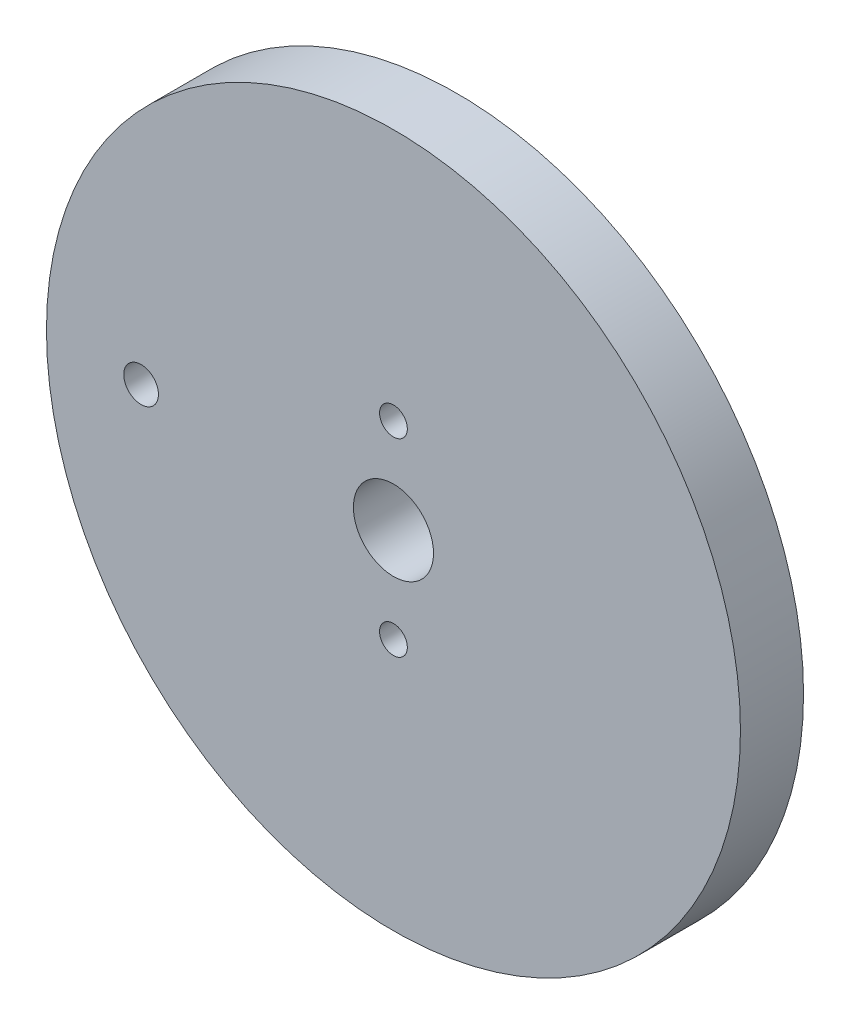
ISO-10303-21;
HEADER;
FILE_DESCRIPTION(('STEP AP214'),'2;1');
FILE_NAME('part.step','',(''),(''),'','','');
FILE_SCHEMA(('AUTOMOTIVE_DESIGN { 1 0 10303 214 1 1 1 1 }'));
ENDSEC;
DATA;
#1=APPLICATION_CONTEXT('core data for automotive mechanical design processes');
#2=APPLICATION_PROTOCOL_DEFINITION('international standard','automotive_design',2000,#1);
#3=PRODUCT_CONTEXT('',#1,'mechanical');
#4=PRODUCT('Part','Part','',(#3));
#5=PRODUCT_RELATED_PRODUCT_CATEGORY('part','',(#4));
#6=PRODUCT_DEFINITION_FORMATION('','',#4);
#7=PRODUCT_DEFINITION_CONTEXT('part definition',#1,'design');
#8=PRODUCT_DEFINITION('design','',#6,#7);
#9=PRODUCT_DEFINITION_SHAPE('','',#8);
#10=(LENGTH_UNIT() NAMED_UNIT(*) SI_UNIT(.MILLI.,.METRE.));
#11=(NAMED_UNIT(*) PLANE_ANGLE_UNIT() SI_UNIT($,.RADIAN.));
#12=(NAMED_UNIT(*) SI_UNIT($,.STERADIAN.) SOLID_ANGLE_UNIT());
#13=UNCERTAINTY_MEASURE_WITH_UNIT(LENGTH_MEASURE(1.E-05),#10,'distance_accuracy_value','');
#14=(GEOMETRIC_REPRESENTATION_CONTEXT(3) GLOBAL_UNCERTAINTY_ASSIGNED_CONTEXT((#13)) GLOBAL_UNIT_ASSIGNED_CONTEXT((#10,
#11,#12)) REPRESENTATION_CONTEXT('',''));
#15=CARTESIAN_POINT('',(0.,0.,0.));
#16=DIRECTION('',(0.,0.,1.));
#17=DIRECTION('',(1.,0.,0.));
#18=AXIS2_PLACEMENT_3D('',#15,#16,#17);
#19=CARTESIAN_POINT('',(0.,0.,10.));
#20=DIRECTION('',(0.,0.,-1.));
#21=DIRECTION('',(-1.,0.,0.));
#22=AXIS2_PLACEMENT_3D('',#19,#20,#21);
#23=CYLINDRICAL_SURFACE('',#22,55.);
#24=CARTESIAN_POINT('',(0.,0.,10.));
#25=DIRECTION('',(0.,0.,1.));
#26=DIRECTION('',(1.,0.,0.));
#27=AXIS2_PLACEMENT_3D('',#24,#25,#26);
#28=CIRCLE('',#27,55.);
#29=CARTESIAN_POINT('',(55.,0.,10.));
#30=VERTEX_POINT('',#29);
#31=EDGE_CURVE('E10',#30,#30,#28,.T.);
#32=ORIENTED_EDGE('',*,*,#31,.F.);
#33=EDGE_LOOP('',(#32));
#34=FACE_BOUND('',#33,.T.);
#35=CARTESIAN_POINT('',(0.,0.,0.));
#36=DIRECTION('',(0.,0.,1.));
#37=DIRECTION('',(1.,0.,0.));
#38=AXIS2_PLACEMENT_3D('',#35,#36,#37);
#39=CIRCLE('',#38,55.);
#40=CARTESIAN_POINT('',(55.,0.,0.));
#41=VERTEX_POINT('',#40);
#42=EDGE_CURVE('E46',#41,#41,#39,.T.);
#43=ORIENTED_EDGE('',*,*,#42,.T.);
#44=EDGE_LOOP('',(#43));
#45=FACE_BOUND('',#44,.T.);
#46=ADVANCED_FACE('F43',(#34,#45),#23,.T.);
#47=CARTESIAN_POINT('',(0.,0.,10.));
#48=DIRECTION('',(0.,0.,1.));
#49=DIRECTION('',(1.,0.,0.));
#50=AXIS2_PLACEMENT_3D('',#47,#48,#49);
#51=PLANE('',#50);
#52=CARTESIAN_POINT('',(-40.,0.,10.));
#53=DIRECTION('',(0.,0.,1.));
#54=DIRECTION('',(1.,0.,0.));
#55=AXIS2_PLACEMENT_3D('',#52,#53,#54);
#56=CIRCLE('',#55,2.74999999999999);
#57=CARTESIAN_POINT('',(-37.25,0.,10.));
#58=VERTEX_POINT('',#57);
#59=EDGE_CURVE('E81',#58,#58,#56,.T.);
#60=ORIENTED_EDGE('',*,*,#59,.F.);
#61=EDGE_LOOP('',(#60));
#62=FACE_BOUND('',#61,.T.);
#63=CARTESIAN_POINT('',(0.,15.,10.));
#64=DIRECTION('',(0.,0.,1.));
#65=DIRECTION('',(1.,0.,0.));
#66=AXIS2_PLACEMENT_3D('',#63,#64,#65);
#67=CIRCLE('',#66,2.2);
#68=CARTESIAN_POINT('',(2.2,15.,10.));
#69=VERTEX_POINT('',#68);
#70=EDGE_CURVE('E69',#69,#69,#67,.T.);
#71=ORIENTED_EDGE('',*,*,#70,.F.);
#72=EDGE_LOOP('',(#71));
#73=FACE_BOUND('',#72,.T.);
#74=CARTESIAN_POINT('',(3.23790517374325E-13,-15.,10.));
#75=DIRECTION('',(0.,0.,1.));
#76=DIRECTION('',(1.,0.,0.));
#77=AXIS2_PLACEMENT_3D('',#74,#75,#76);
#78=CIRCLE('',#77,2.2);
#79=CARTESIAN_POINT('',(2.20000000000032,-15.,10.));
#80=VERTEX_POINT('',#79);
#81=EDGE_CURVE('E70',#80,#80,#78,.T.);
#82=ORIENTED_EDGE('',*,*,#81,.F.);
#83=EDGE_LOOP('',(#82));
#84=FACE_BOUND('',#83,.T.);
#85=CARTESIAN_POINT('',(0.,0.,10.));
#86=DIRECTION('',(0.,0.,1.));
#87=DIRECTION('',(1.,0.,0.));
#88=AXIS2_PLACEMENT_3D('',#85,#86,#87);
#89=CIRCLE('',#88,6.35);
#90=CARTESIAN_POINT('',(6.35,0.,10.));
#91=VERTEX_POINT('',#90);
#92=EDGE_CURVE('E60',#91,#91,#89,.T.);
#93=ORIENTED_EDGE('',*,*,#92,.F.);
#94=EDGE_LOOP('',(#93));
#95=FACE_BOUND('',#94,.T.);
#96=ORIENTED_EDGE('',*,*,#31,.T.);
#97=EDGE_LOOP('',(#96));
#98=FACE_BOUND('',#97,.T.);
#99=ADVANCED_FACE('F99',(#62,#73,#84,#95,#98),#51,.T.);
#100=CARTESIAN_POINT('',(0.,0.,0.));
#101=DIRECTION('',(0.,0.,1.));
#102=DIRECTION('',(1.,0.,0.));
#103=AXIS2_PLACEMENT_3D('',#100,#101,#102);
#104=PLANE('',#103);
#105=CARTESIAN_POINT('',(-40.,0.,0.));
#106=DIRECTION('',(0.,0.,1.));
#107=DIRECTION('',(1.,0.,0.));
#108=AXIS2_PLACEMENT_3D('',#105,#106,#107);
#109=CIRCLE('',#108,2.74999999999999);
#110=CARTESIAN_POINT('',(-37.25,0.,0.));
#111=VERTEX_POINT('',#110);
#112=EDGE_CURVE('E74',#111,#111,#109,.T.);
#113=ORIENTED_EDGE('',*,*,#112,.T.);
#114=EDGE_LOOP('',(#113));
#115=FACE_BOUND('',#114,.T.);
#116=CARTESIAN_POINT('',(0.,15.,0.));
#117=DIRECTION('',(0.,0.,1.));
#118=DIRECTION('',(1.,0.,0.));
#119=AXIS2_PLACEMENT_3D('',#116,#117,#118);
#120=CIRCLE('',#119,2.2);
#121=CARTESIAN_POINT('',(2.2,15.,0.));
#122=VERTEX_POINT('',#121);
#123=EDGE_CURVE('E64',#122,#122,#120,.F.);
#124=ORIENTED_EDGE('',*,*,#123,.F.);
#125=EDGE_LOOP('',(#124));
#126=FACE_BOUND('',#125,.T.);
#127=CARTESIAN_POINT('',(3.23790517374325E-13,-15.,0.));
#128=DIRECTION('',(0.,0.,1.));
#129=DIRECTION('',(1.,0.,0.));
#130=AXIS2_PLACEMENT_3D('',#127,#128,#129);
#131=CIRCLE('',#130,2.2);
#132=CARTESIAN_POINT('',(2.20000000000032,-15.,0.));
#133=VERTEX_POINT('',#132);
#134=EDGE_CURVE('E65',#133,#133,#131,.F.);
#135=ORIENTED_EDGE('',*,*,#134,.F.);
#136=EDGE_LOOP('',(#135));
#137=FACE_BOUND('',#136,.T.);
#138=CARTESIAN_POINT('',(0.,0.,0.));
#139=DIRECTION('',(0.,0.,1.));
#140=DIRECTION('',(1.,0.,0.));
#141=AXIS2_PLACEMENT_3D('',#138,#139,#140);
#142=CIRCLE('',#141,6.35);
#143=CARTESIAN_POINT('',(6.35,0.,0.));
#144=VERTEX_POINT('',#143);
#145=EDGE_CURVE('E55',#144,#144,#142,.F.);
#146=ORIENTED_EDGE('',*,*,#145,.F.);
#147=EDGE_LOOP('',(#146));
#148=FACE_BOUND('',#147,.T.);
#149=ORIENTED_EDGE('',*,*,#42,.F.);
#150=EDGE_LOOP('',(#149));
#151=FACE_BOUND('',#150,.T.);
#152=ADVANCED_FACE('F89',(#115,#126,#137,#148,#151),#104,.F.);
#153=CARTESIAN_POINT('',(0.,0.,-17.9605122421383));
#154=DIRECTION('',(0.,0.,1.));
#155=DIRECTION('',(1.,0.,0.));
#156=AXIS2_PLACEMENT_3D('',#153,#154,#155);
#157=CYLINDRICAL_SURFACE('',#156,6.35);
#158=ORIENTED_EDGE('',*,*,#145,.T.);
#159=EDGE_LOOP('',(#158));
#160=FACE_BOUND('',#159,.T.);
#161=ORIENTED_EDGE('',*,*,#92,.T.);
#162=EDGE_LOOP('',(#161));
#163=FACE_BOUND('',#162,.T.);
#164=ADVANCED_FACE('F109',(#160,#163),#157,.F.);
#165=CARTESIAN_POINT('',(3.23790517374325E-13,-15.,-6.22253967444162));
#166=DIRECTION('',(0.,0.,1.));
#167=DIRECTION('',(1.,0.,0.));
#168=AXIS2_PLACEMENT_3D('',#165,#166,#167);
#169=CYLINDRICAL_SURFACE('',#168,2.2);
#170=ORIENTED_EDGE('',*,*,#134,.T.);
#171=EDGE_LOOP('',(#170));
#172=FACE_BOUND('',#171,.T.);
#173=ORIENTED_EDGE('',*,*,#81,.T.);
#174=EDGE_LOOP('',(#173));
#175=FACE_BOUND('',#174,.T.);
#176=ADVANCED_FACE('F111',(#172,#175),#169,.F.);
#177=CARTESIAN_POINT('',(0.,15.,-6.22253967444162));
#178=DIRECTION('',(0.,0.,1.));
#179=DIRECTION('',(1.,0.,0.));
#180=AXIS2_PLACEMENT_3D('',#177,#178,#179);
#181=CYLINDRICAL_SURFACE('',#180,2.2);
#182=ORIENTED_EDGE('',*,*,#123,.T.);
#183=EDGE_LOOP('',(#182));
#184=FACE_BOUND('',#183,.T.);
#185=ORIENTED_EDGE('',*,*,#70,.T.);
#186=EDGE_LOOP('',(#185));
#187=FACE_BOUND('',#186,.T.);
#188=ADVANCED_FACE('F95',(#184,#187),#181,.F.);
#189=CARTESIAN_POINT('',(-40.,0.,0.));
#190=DIRECTION('',(0.,0.,1.));
#191=DIRECTION('',(1.,0.,0.));
#192=AXIS2_PLACEMENT_3D('',#189,#190,#191);
#193=CYLINDRICAL_SURFACE('',#192,2.74999999999999);
#194=ORIENTED_EDGE('',*,*,#112,.F.);
#195=EDGE_LOOP('',(#194));
#196=FACE_BOUND('',#195,.T.);
#197=ORIENTED_EDGE('',*,*,#59,.T.);
#198=EDGE_LOOP('',(#197));
#199=FACE_BOUND('',#198,.T.);
#200=ADVANCED_FACE('F92',(#196,#199),#193,.F.);
#201=CLOSED_SHELL('',(#46,#99,#152,#164,#176,#188,#200));
#202=MANIFOLD_SOLID_BREP('B2',#201);
#203=ADVANCED_BREP_SHAPE_REPRESENTATION('',(#18,#202),#14);
#204=SHAPE_DEFINITION_REPRESENTATION(#9,#203);
ENDSEC;
END-ISO-10303-21;
